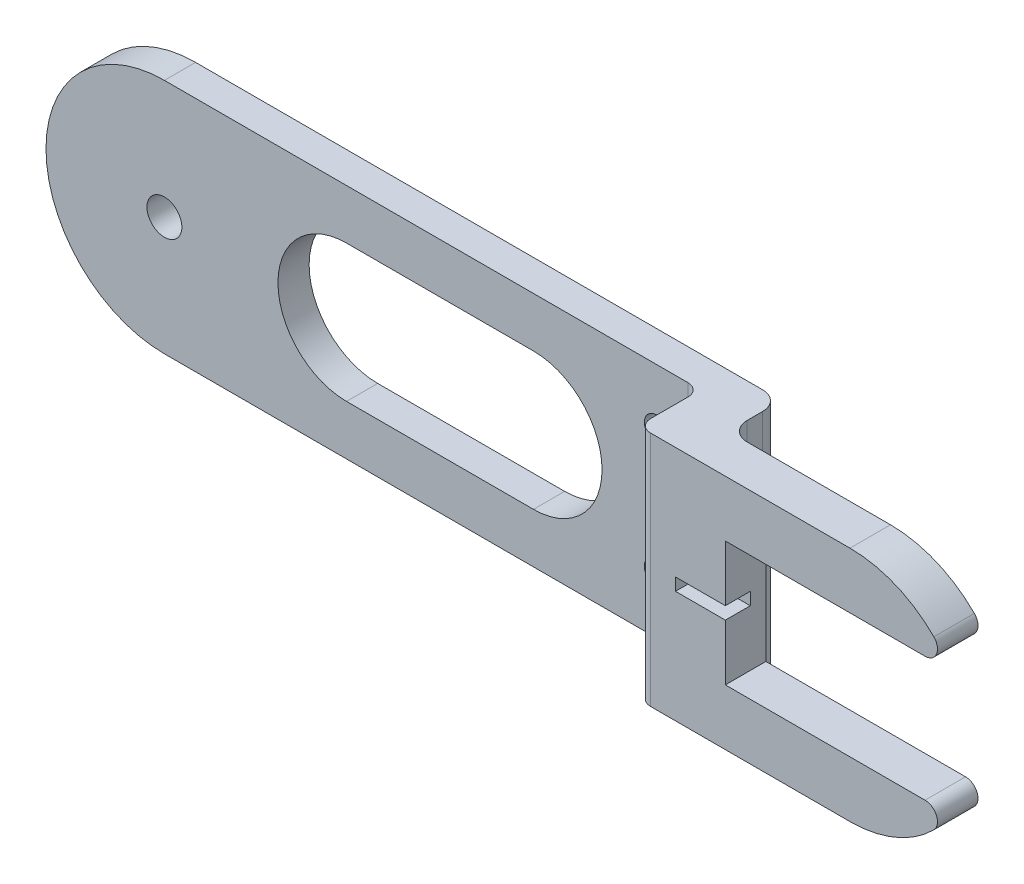
ISO-10303-21;
HEADER;
FILE_DESCRIPTION(('STEP AP214'),'2;1');
FILE_NAME('part.step','',(''),(''),'','','');
FILE_SCHEMA(('AUTOMOTIVE_DESIGN { 1 0 10303 214 1 1 1 1 }'));
ENDSEC;
DATA;
#1=APPLICATION_CONTEXT('core data for automotive mechanical design processes');
#2=APPLICATION_PROTOCOL_DEFINITION('international standard','automotive_design',2000,#1);
#3=PRODUCT_CONTEXT('',#1,'mechanical');
#4=PRODUCT('Part','Part','',(#3));
#5=PRODUCT_RELATED_PRODUCT_CATEGORY('part','',(#4));
#6=PRODUCT_DEFINITION_FORMATION('','',#4);
#7=PRODUCT_DEFINITION_CONTEXT('part definition',#1,'design');
#8=PRODUCT_DEFINITION('design','',#6,#7);
#9=PRODUCT_DEFINITION_SHAPE('','',#8);
#10=(LENGTH_UNIT() NAMED_UNIT(*) SI_UNIT(.MILLI.,.METRE.));
#11=(NAMED_UNIT(*) PLANE_ANGLE_UNIT() SI_UNIT($,.RADIAN.));
#12=(NAMED_UNIT(*) SI_UNIT($,.STERADIAN.) SOLID_ANGLE_UNIT());
#13=UNCERTAINTY_MEASURE_WITH_UNIT(LENGTH_MEASURE(1.E-05),#10,'distance_accuracy_value','');
#14=(GEOMETRIC_REPRESENTATION_CONTEXT(3) GLOBAL_UNCERTAINTY_ASSIGNED_CONTEXT((#13)) GLOBAL_UNIT_ASSIGNED_CONTEXT((#10,
#11,#12)) REPRESENTATION_CONTEXT('',''));
#15=CARTESIAN_POINT('',(0.,0.,0.));
#16=DIRECTION('',(0.,0.,1.));
#17=DIRECTION('',(1.,0.,0.));
#18=AXIS2_PLACEMENT_3D('',#15,#16,#17);
#19=CARTESIAN_POINT('',(0.,0.,5.));
#20=DIRECTION('',(0.,0.,1.));
#21=DIRECTION('',(1.,0.,0.));
#22=AXIS2_PLACEMENT_3D('',#19,#20,#21);
#23=PLANE('',#22);
#24=CARTESIAN_POINT('',(79.,-10.,5.));
#25=DIRECTION('',(0.,0.,1.));
#26=DIRECTION('',(1.,0.,0.));
#27=AXIS2_PLACEMENT_3D('',#24,#25,#26);
#28=CIRCLE('',#27,2.);
#29=CARTESIAN_POINT('',(81.,-10.,5.));
#30=VERTEX_POINT('',#29);
#31=EDGE_CURVE('E305',#30,#30,#28,.T.);
#32=ORIENTED_EDGE('',*,*,#31,.F.);
#33=EDGE_LOOP('',(#32));
#34=FACE_BOUND('',#33,.T.);
#35=CARTESIAN_POINT('',(79.,10.,5.));
#36=DIRECTION('',(0.,0.,1.));
#37=DIRECTION('',(1.,0.,0.));
#38=AXIS2_PLACEMENT_3D('',#35,#36,#37);
#39=CIRCLE('',#38,2.);
#40=CARTESIAN_POINT('',(81.,10.,5.));
#41=VERTEX_POINT('',#40);
#42=EDGE_CURVE('E427',#41,#41,#39,.T.);
#43=ORIENTED_EDGE('',*,*,#42,.F.);
#44=EDGE_LOOP('',(#43));
#45=FACE_BOUND('',#44,.T.);
#46=DIRECTION('',(1.,0.,0.));
#47=VECTOR('',#46,1.);
#48=CARTESIAN_POINT('',(0.,-19.,5.));
#49=LINE('',#48,#47);
#50=CARTESIAN_POINT('',(0.,-19.,5.));
#51=VERTEX_POINT('',#50);
#52=CARTESIAN_POINT('',(84.,-19.,5.));
#53=VERTEX_POINT('',#52);
#54=EDGE_CURVE('E328',#51,#53,#49,.T.);
#55=ORIENTED_EDGE('',*,*,#54,.T.);
#56=DIRECTION('',(0.,-1.,0.));
#57=VECTOR('',#56,1.);
#58=CARTESIAN_POINT('',(84.,0.,5.));
#59=LINE('',#58,#57);
#60=CARTESIAN_POINT('',(84.,19.,5.));
#61=VERTEX_POINT('',#60);
#62=EDGE_CURVE('E265',#53,#61,#59,.F.);
#63=ORIENTED_EDGE('',*,*,#62,.T.);
#64=DIRECTION('',(-1.,0.,0.));
#65=VECTOR('',#64,1.);
#66=CARTESIAN_POINT('',(0.,19.,5.));
#67=LINE('',#66,#65);
#68=CARTESIAN_POINT('',(0.,19.,5.));
#69=VERTEX_POINT('',#68);
#70=EDGE_CURVE('E315',#61,#69,#67,.T.);
#71=ORIENTED_EDGE('',*,*,#70,.T.);
#72=CARTESIAN_POINT('',(0.,0.,5.));
#73=DIRECTION('',(0.,0.,1.));
#74=DIRECTION('',(1.,0.,0.));
#75=AXIS2_PLACEMENT_3D('',#72,#73,#74);
#76=CIRCLE('',#75,19.);
#77=EDGE_CURVE('E320',#69,#51,#76,.T.);
#78=ORIENTED_EDGE('',*,*,#77,.T.);
#79=EDGE_LOOP('',(#55,#63,#71,#78));
#80=FACE_BOUND('',#79,.T.);
#81=CARTESIAN_POINT('',(0.,0.,5.));
#82=DIRECTION('',(0.,0.,1.));
#83=DIRECTION('',(1.,0.,0.));
#84=AXIS2_PLACEMENT_3D('',#81,#82,#83);
#85=CIRCLE('',#84,2.8);
#86=CARTESIAN_POINT('',(2.8,0.,5.));
#87=VERTEX_POINT('',#86);
#88=EDGE_CURVE('E326',#87,#87,#85,.T.);
#89=ORIENTED_EDGE('',*,*,#88,.F.);
#90=EDGE_LOOP('',(#89));
#91=FACE_BOUND('',#90,.T.);
#92=DIRECTION('',(1.,0.,0.));
#93=VECTOR('',#92,1.);
#94=CARTESIAN_POINT('',(29.2177332505722,-11.,5.));
#95=LINE('',#94,#93);
#96=CARTESIAN_POINT('',(29.2177332505722,-11.,5.));
#97=VERTEX_POINT('',#96);
#98=CARTESIAN_POINT('',(59.2177332505723,-11.,5.));
#99=VERTEX_POINT('',#98);
#100=EDGE_CURVE('E367',#97,#99,#95,.T.);
#101=ORIENTED_EDGE('',*,*,#100,.F.);
#102=CARTESIAN_POINT('',(29.2177332505722,0.,5.));
#103=DIRECTION('',(0.,0.,1.));
#104=DIRECTION('',(1.,0.,0.));
#105=AXIS2_PLACEMENT_3D('',#102,#103,#104);
#106=CIRCLE('',#105,11.);
#107=CARTESIAN_POINT('',(29.2177332505722,11.,5.));
#108=VERTEX_POINT('',#107);
#109=EDGE_CURVE('E352',#108,#97,#106,.T.);
#110=ORIENTED_EDGE('',*,*,#109,.F.);
#111=DIRECTION('',(-1.,0.,0.));
#112=VECTOR('',#111,1.);
#113=CARTESIAN_POINT('',(29.2177332505722,11.,5.));
#114=LINE('',#113,#112);
#115=CARTESIAN_POINT('',(59.2177332505723,11.,5.));
#116=VERTEX_POINT('',#115);
#117=EDGE_CURVE('E348',#116,#108,#114,.T.);
#118=ORIENTED_EDGE('',*,*,#117,.F.);
#119=CARTESIAN_POINT('',(59.2177332505723,0.,5.));
#120=DIRECTION('',(0.,0.,1.));
#121=DIRECTION('',(1.,0.,0.));
#122=AXIS2_PLACEMENT_3D('',#119,#120,#121);
#123=CIRCLE('',#122,11.);
#124=EDGE_CURVE('E364',#99,#116,#123,.T.);
#125=ORIENTED_EDGE('',*,*,#124,.F.);
#126=EDGE_LOOP('',(#101,#110,#118,#125));
#127=FACE_BOUND('',#126,.T.);
#128=ADVANCED_FACE('F34',(#34,#45,#80,#91,#127),#23,.T.);
#129=CARTESIAN_POINT('',(0.,0.,0.));
#130=DIRECTION('',(0.,0.,1.));
#131=DIRECTION('',(1.,0.,0.));
#132=AXIS2_PLACEMENT_3D('',#129,#130,#131);
#133=PLANE('',#132);
#134=CARTESIAN_POINT('',(79.,-10.,0.));
#135=DIRECTION('',(0.,0.,1.));
#136=DIRECTION('',(1.,0.,0.));
#137=AXIS2_PLACEMENT_3D('',#134,#135,#136);
#138=CIRCLE('',#137,2.);
#139=CARTESIAN_POINT('',(81.,-10.,0.));
#140=VERTEX_POINT('',#139);
#141=EDGE_CURVE('E430',#140,#140,#138,.T.);
#142=ORIENTED_EDGE('',*,*,#141,.T.);
#143=EDGE_LOOP('',(#142));
#144=FACE_BOUND('',#143,.T.);
#145=CARTESIAN_POINT('',(79.,10.,0.));
#146=DIRECTION('',(0.,0.,1.));
#147=DIRECTION('',(1.,0.,0.));
#148=AXIS2_PLACEMENT_3D('',#145,#146,#147);
#149=CIRCLE('',#148,2.);
#150=CARTESIAN_POINT('',(81.,10.,0.));
#151=VERTEX_POINT('',#150);
#152=EDGE_CURVE('E416',#151,#151,#149,.T.);
#153=ORIENTED_EDGE('',*,*,#152,.T.);
#154=EDGE_LOOP('',(#153));
#155=FACE_BOUND('',#154,.T.);
#156=CARTESIAN_POINT('',(0.,0.,0.));
#157=DIRECTION('',(0.,0.,1.));
#158=DIRECTION('',(1.,0.,0.));
#159=AXIS2_PLACEMENT_3D('',#156,#157,#158);
#160=CIRCLE('',#159,2.8);
#161=CARTESIAN_POINT('',(2.8,0.,0.));
#162=VERTEX_POINT('',#161);
#163=EDGE_CURVE('E333',#162,#162,#160,.T.);
#164=ORIENTED_EDGE('',*,*,#163,.T.);
#165=EDGE_LOOP('',(#164));
#166=FACE_BOUND('',#165,.T.);
#167=DIRECTION('',(-1.,0.,0.));
#168=VECTOR('',#167,1.);
#169=CARTESIAN_POINT('',(0.,19.,0.));
#170=LINE('',#169,#168);
#171=CARTESIAN_POINT('',(91.0000000000001,19.,0.));
#172=VERTEX_POINT('',#171);
#173=CARTESIAN_POINT('',(0.,19.,0.));
#174=VERTEX_POINT('',#173);
#175=EDGE_CURVE('E318',#172,#174,#170,.T.);
#176=ORIENTED_EDGE('',*,*,#175,.F.);
#177=DIRECTION('',(0.,1.,0.));
#178=VECTOR('',#177,1.);
#179=CARTESIAN_POINT('',(91.0000000000001,0.,0.));
#180=LINE('',#179,#178);
#181=CARTESIAN_POINT('',(91.0000000000001,-19.,0.));
#182=VERTEX_POINT('',#181);
#183=EDGE_CURVE('E49',#172,#182,#180,.F.);
#184=ORIENTED_EDGE('',*,*,#183,.T.);
#185=DIRECTION('',(1.,0.,0.));
#186=VECTOR('',#185,1.);
#187=CARTESIAN_POINT('',(0.,-19.,0.));
#188=LINE('',#187,#186);
#189=CARTESIAN_POINT('',(0.,-19.,0.));
#190=VERTEX_POINT('',#189);
#191=EDGE_CURVE('E321',#190,#182,#188,.T.);
#192=ORIENTED_EDGE('',*,*,#191,.F.);
#193=CARTESIAN_POINT('',(0.,0.,0.));
#194=DIRECTION('',(0.,0.,1.));
#195=DIRECTION('',(1.,0.,0.));
#196=AXIS2_PLACEMENT_3D('',#193,#194,#195);
#197=CIRCLE('',#196,19.);
#198=EDGE_CURVE('E323',#174,#190,#197,.T.);
#199=ORIENTED_EDGE('',*,*,#198,.F.);
#200=EDGE_LOOP('',(#176,#184,#192,#199));
#201=FACE_BOUND('',#200,.T.);
#202=CARTESIAN_POINT('',(29.2177332505722,0.,0.));
#203=DIRECTION('',(0.,0.,1.));
#204=DIRECTION('',(1.,0.,0.));
#205=AXIS2_PLACEMENT_3D('',#202,#203,#204);
#206=CIRCLE('',#205,11.);
#207=CARTESIAN_POINT('',(29.2177332505722,11.,0.));
#208=VERTEX_POINT('',#207);
#209=CARTESIAN_POINT('',(29.2177332505722,-11.,0.));
#210=VERTEX_POINT('',#209);
#211=EDGE_CURVE('E359',#208,#210,#206,.T.);
#212=ORIENTED_EDGE('',*,*,#211,.T.);
#213=DIRECTION('',(1.,0.,0.));
#214=VECTOR('',#213,1.);
#215=CARTESIAN_POINT('',(29.2177332505722,-11.,0.));
#216=LINE('',#215,#214);
#217=CARTESIAN_POINT('',(59.2177332505723,-11.,0.));
#218=VERTEX_POINT('',#217);
#219=EDGE_CURVE('E356',#210,#218,#216,.T.);
#220=ORIENTED_EDGE('',*,*,#219,.T.);
#221=CARTESIAN_POINT('',(59.2177332505723,0.,0.));
#222=DIRECTION('',(0.,0.,1.));
#223=DIRECTION('',(1.,0.,0.));
#224=AXIS2_PLACEMENT_3D('',#221,#222,#223);
#225=CIRCLE('',#224,11.);
#226=CARTESIAN_POINT('',(59.2177332505723,11.,0.));
#227=VERTEX_POINT('',#226);
#228=EDGE_CURVE('E353',#218,#227,#225,.T.);
#229=ORIENTED_EDGE('',*,*,#228,.T.);
#230=DIRECTION('',(-1.,0.,0.));
#231=VECTOR('',#230,1.);
#232=CARTESIAN_POINT('',(29.2177332505722,11.,0.));
#233=LINE('',#232,#231);
#234=EDGE_CURVE('E349',#227,#208,#233,.T.);
#235=ORIENTED_EDGE('',*,*,#234,.T.);
#236=EDGE_LOOP('',(#212,#220,#229,#235));
#237=FACE_BOUND('',#236,.T.);
#238=ADVANCED_FACE('F449',(#144,#155,#166,#201,#237),#133,.F.);
#239=CARTESIAN_POINT('',(0.,0.,5.));
#240=DIRECTION('',(0.,0.,-1.));
#241=DIRECTION('',(-1.,0.,0.));
#242=AXIS2_PLACEMENT_3D('',#239,#240,#241);
#243=CYLINDRICAL_SURFACE('',#242,19.);
#244=ORIENTED_EDGE('',*,*,#198,.T.);
#245=DIRECTION('',(0.,0.,-1.));
#246=VECTOR('',#245,1.);
#247=CARTESIAN_POINT('',(0.,-19.,5.));
#248=LINE('',#247,#246);
#249=EDGE_CURVE('E233',#51,#190,#248,.T.);
#250=ORIENTED_EDGE('',*,*,#249,.F.);
#251=ORIENTED_EDGE('',*,*,#77,.F.);
#252=DIRECTION('',(0.,0.,-1.));
#253=VECTOR('',#252,1.);
#254=CARTESIAN_POINT('',(0.,19.,5.));
#255=LINE('',#254,#253);
#256=EDGE_CURVE('E311',#69,#174,#255,.T.);
#257=ORIENTED_EDGE('',*,*,#256,.T.);
#258=EDGE_LOOP('',(#244,#250,#251,#257));
#259=FACE_BOUND('',#258,.T.);
#260=ADVANCED_FACE('F452',(#259),#243,.T.);
#261=CARTESIAN_POINT('',(0.,-19.,5.));
#262=DIRECTION('',(0.,1.,0.));
#263=DIRECTION('',(0.,0.,1.));
#264=AXIS2_PLACEMENT_3D('',#261,#262,#263);
#265=PLANE('',#264);
#266=ORIENTED_EDGE('',*,*,#191,.T.);
#267=CARTESIAN_POINT('',(91.0000000000001,-19.,3.));
#268=DIRECTION('',(0.,1.,0.));
#269=DIRECTION('',(0.,0.,1.));
#270=AXIS2_PLACEMENT_3D('',#267,#268,#269);
#271=CIRCLE('',#270,3.);
#272=CARTESIAN_POINT('',(94.0000000000001,-19.,3.));
#273=VERTEX_POINT('',#272);
#274=EDGE_CURVE('E281',#182,#273,#271,.F.);
#275=ORIENTED_EDGE('',*,*,#274,.T.);
#276=DIRECTION('',(0.,0.,-1.));
#277=VECTOR('',#276,1.);
#278=CARTESIAN_POINT('',(94.0000000000001,-19.,8.5));
#279=LINE('',#278,#277);
#280=CARTESIAN_POINT('',(94.0000000000001,-19.,5.5));
#281=VERTEX_POINT('',#280);
#282=EDGE_CURVE('E293',#281,#273,#279,.T.);
#283=ORIENTED_EDGE('',*,*,#282,.F.);
#284=CARTESIAN_POINT('',(97.0000000000001,-19.,5.5));
#285=DIRECTION('',(0.,1.,0.));
#286=DIRECTION('',(0.,0.,1.));
#287=AXIS2_PLACEMENT_3D('',#284,#285,#286);
#288=CIRCLE('',#287,3.);
#289=CARTESIAN_POINT('',(97.0000000000001,-19.,8.5));
#290=VERTEX_POINT('',#289);
#291=EDGE_CURVE('E11',#281,#290,#288,.T.);
#292=ORIENTED_EDGE('',*,*,#291,.T.);
#293=DIRECTION('',(-1.,0.,0.));
#294=VECTOR('',#293,1.);
#295=CARTESIAN_POINT('',(94.0000000000001,-19.,8.5));
#296=LINE('',#295,#294);
#297=CARTESIAN_POINT('',(120.,-19.,8.5));
#298=VERTEX_POINT('',#297);
#299=EDGE_CURVE('E210',#298,#290,#296,.T.);
#300=ORIENTED_EDGE('',*,*,#299,.F.);
#301=DIRECTION('',(0.,0.,-1.));
#302=VECTOR('',#301,1.);
#303=CARTESIAN_POINT('',(120.,-19.,5.));
#304=LINE('',#303,#302);
#305=CARTESIAN_POINT('',(120.,-19.,15.));
#306=VERTEX_POINT('',#305);
#307=EDGE_CURVE('E224',#306,#298,#304,.T.);
#308=ORIENTED_EDGE('',*,*,#307,.F.);
#309=DIRECTION('',(1.,0.,0.));
#310=VECTOR('',#309,1.);
#311=CARTESIAN_POINT('',(86.,-19.,15.));
#312=LINE('',#311,#310);
#313=CARTESIAN_POINT('',(88.0000000000001,-19.,15.));
#314=VERTEX_POINT('',#313);
#315=EDGE_CURVE('E394',#314,#306,#312,.T.);
#316=ORIENTED_EDGE('',*,*,#315,.F.);
#317=CARTESIAN_POINT('',(88.0000000000001,-19.,13.));
#318=DIRECTION('',(0.,1.,0.));
#319=DIRECTION('',(0.,0.,1.));
#320=AXIS2_PLACEMENT_3D('',#317,#318,#319);
#321=CIRCLE('',#320,2.);
#322=CARTESIAN_POINT('',(86.,-19.,13.));
#323=VERTEX_POINT('',#322);
#324=EDGE_CURVE('E256',#314,#323,#321,.F.);
#325=ORIENTED_EDGE('',*,*,#324,.T.);
#326=DIRECTION('',(0.,0.,-1.));
#327=VECTOR('',#326,1.);
#328=CARTESIAN_POINT('',(86.,-19.,15.));
#329=LINE('',#328,#327);
#330=CARTESIAN_POINT('',(86.,-19.,7.));
#331=VERTEX_POINT('',#330);
#332=EDGE_CURVE('E372',#323,#331,#329,.T.);
#333=ORIENTED_EDGE('',*,*,#332,.T.);
#334=CARTESIAN_POINT('',(84.,-19.,7.));
#335=DIRECTION('',(0.,1.,0.));
#336=DIRECTION('',(0.,0.,1.));
#337=AXIS2_PLACEMENT_3D('',#334,#335,#336);
#338=CIRCLE('',#337,2.);
#339=EDGE_CURVE('E267',#331,#53,#338,.T.);
#340=ORIENTED_EDGE('',*,*,#339,.T.);
#341=ORIENTED_EDGE('',*,*,#54,.F.);
#342=ORIENTED_EDGE('',*,*,#249,.T.);
#343=EDGE_LOOP('',(#266,#275,#283,#292,#300,#308,#316,#325,#333,#340,#341,#342));
#344=FACE_BOUND('',#343,.T.);
#345=ADVANCED_FACE('F222',(#344),#265,.F.);
#346=CARTESIAN_POINT('',(120.,0.,5.));
#347=DIRECTION('',(0.,0.,-1.));
#348=DIRECTION('',(-1.,0.,0.));
#349=AXIS2_PLACEMENT_3D('',#346,#347,#348);
#350=CYLINDRICAL_SURFACE('',#349,19.);
#351=ORIENTED_EDGE('',*,*,#307,.T.);
#352=CARTESIAN_POINT('',(120.,0.,8.5));
#353=DIRECTION('',(0.,0.,1.));
#354=DIRECTION('',(1.,0.,0.));
#355=AXIS2_PLACEMENT_3D('',#352,#353,#354);
#356=CIRCLE('',#355,19.);
#357=CARTESIAN_POINT('',(133.458252764533,-13.4117647058824,8.5));
#358=VERTEX_POINT('',#357);
#359=EDGE_CURVE('E206',#298,#358,#356,.T.);
#360=ORIENTED_EDGE('',*,*,#359,.T.);
#361=DIRECTION('',(0.,0.,-1.));
#362=VECTOR('',#361,1.);
#363=CARTESIAN_POINT('',(133.458252764533,-13.4117647058824,5.));
#364=LINE('',#363,#362);
#365=CARTESIAN_POINT('',(133.458252764533,-13.4117647058824,15.));
#366=VERTEX_POINT('',#365);
#367=EDGE_CURVE('E251',#358,#366,#364,.F.);
#368=ORIENTED_EDGE('',*,*,#367,.T.);
#369=CARTESIAN_POINT('',(120.,0.,15.));
#370=DIRECTION('',(0.,0.,1.));
#371=DIRECTION('',(1.,0.,0.));
#372=AXIS2_PLACEMENT_3D('',#369,#370,#371);
#373=CIRCLE('',#372,19.);
#374=EDGE_CURVE('E232',#306,#366,#373,.T.);
#375=ORIENTED_EDGE('',*,*,#374,.F.);
#376=EDGE_LOOP('',(#351,#360,#368,#375));
#377=FACE_BOUND('',#376,.T.);
#378=ADVANCED_FACE('F230',(#377),#350,.T.);
#379=CARTESIAN_POINT('',(100.,-10.,5.));
#380=DIRECTION('',(0.,-1.,0.));
#381=DIRECTION('',(0.,0.,-1.));
#382=AXIS2_PLACEMENT_3D('',#379,#380,#381);
#383=PLANE('',#382);
#384=DIRECTION('',(0.,0.,-1.));
#385=VECTOR('',#384,1.);
#386=CARTESIAN_POINT('',(132.041594578792,-10.,5.));
#387=LINE('',#386,#385);
#388=CARTESIAN_POINT('',(132.041594578792,-10.,15.));
#389=VERTEX_POINT('',#388);
#390=CARTESIAN_POINT('',(132.041594578792,-10.,8.5));
#391=VERTEX_POINT('',#390);
#392=EDGE_CURVE('E248',#389,#391,#387,.T.);
#393=ORIENTED_EDGE('',*,*,#392,.T.);
#394=DIRECTION('',(-1.,0.,0.));
#395=VECTOR('',#394,1.);
#396=CARTESIAN_POINT('',(100.,-10.,8.5));
#397=LINE('',#396,#395);
#398=CARTESIAN_POINT('',(100.,-10.,8.5));
#399=VERTEX_POINT('',#398);
#400=EDGE_CURVE('E218',#391,#399,#397,.T.);
#401=ORIENTED_EDGE('',*,*,#400,.T.);
#402=DIRECTION('',(0.,0.,-1.));
#403=VECTOR('',#402,1.);
#404=CARTESIAN_POINT('',(100.,-10.,5.));
#405=LINE('',#404,#403);
#406=CARTESIAN_POINT('',(100.,-10.,15.));
#407=VERTEX_POINT('',#406);
#408=EDGE_CURVE('E234',#407,#399,#405,.T.);
#409=ORIENTED_EDGE('',*,*,#408,.F.);
#410=DIRECTION('',(-1.,0.,0.));
#411=VECTOR('',#410,1.);
#412=CARTESIAN_POINT('',(132.041594578792,-10.,15.));
#413=LINE('',#412,#411);
#414=EDGE_CURVE('E387',#389,#407,#413,.T.);
#415=ORIENTED_EDGE('',*,*,#414,.F.);
#416=EDGE_LOOP('',(#393,#401,#409,#415));
#417=FACE_BOUND('',#416,.T.);
#418=ADVANCED_FACE('F488',(#417),#383,.F.);
#419=CARTESIAN_POINT('',(100.,-10.,5.));
#420=DIRECTION('',(-1.,0.,0.));
#421=DIRECTION('',(0.,0.,1.));
#422=AXIS2_PLACEMENT_3D('',#419,#420,#421);
#423=PLANE('',#422);
#424=ORIENTED_EDGE('',*,*,#408,.T.);
#425=DIRECTION('',(0.,1.,0.));
#426=VECTOR('',#425,1.);
#427=CARTESIAN_POINT('',(100.,-10.,8.5));
#428=LINE('',#427,#426);
#429=CARTESIAN_POINT('',(100.,9.99999999999998,8.5));
#430=VERTEX_POINT('',#429);
#431=EDGE_CURVE('E217',#399,#430,#428,.T.);
#432=ORIENTED_EDGE('',*,*,#431,.T.);
#433=DIRECTION('',(0.,0.,-1.));
#434=VECTOR('',#433,1.);
#435=CARTESIAN_POINT('',(100.,9.99999999999998,5.));
#436=LINE('',#435,#434);
#437=CARTESIAN_POINT('',(100.,9.99999999999998,15.));
#438=VERTEX_POINT('',#437);
#439=EDGE_CURVE('E240',#438,#430,#436,.T.);
#440=ORIENTED_EDGE('',*,*,#439,.F.);
#441=DIRECTION('',(0.,1.,0.));
#442=VECTOR('',#441,1.);
#443=CARTESIAN_POINT('',(100.,-10.,15.));
#444=LINE('',#443,#442);
#445=CARTESIAN_POINT('',(100.,0.999999999999996,15.));
#446=VERTEX_POINT('',#445);
#447=EDGE_CURVE('E386',#446,#438,#444,.T.);
#448=ORIENTED_EDGE('',*,*,#447,.F.);
#449=DIRECTION('',(0.,0.,1.));
#450=VECTOR('',#449,1.);
#451=CARTESIAN_POINT('',(100.,0.999999999999996,11.));
#452=LINE('',#451,#450);
#453=CARTESIAN_POINT('',(100.,0.999999999999996,11.));
#454=VERTEX_POINT('',#453);
#455=EDGE_CURVE('E398',#454,#446,#452,.T.);
#456=ORIENTED_EDGE('',*,*,#455,.F.);
#457=DIRECTION('',(0.,1.,0.));
#458=VECTOR('',#457,1.);
#459=CARTESIAN_POINT('',(100.,0.999999999999996,11.));
#460=LINE('',#459,#458);
#461=CARTESIAN_POINT('',(100.,-1.,11.));
#462=VERTEX_POINT('',#461);
#463=EDGE_CURVE('E409',#462,#454,#460,.T.);
#464=ORIENTED_EDGE('',*,*,#463,.F.);
#465=DIRECTION('',(0.,0.,1.));
#466=VECTOR('',#465,1.);
#467=CARTESIAN_POINT('',(100.,-1.,11.));
#468=LINE('',#467,#466);
#469=CARTESIAN_POINT('',(100.,-1.,15.));
#470=VERTEX_POINT('',#469);
#471=EDGE_CURVE('E397',#462,#470,#468,.T.);
#472=ORIENTED_EDGE('',*,*,#471,.T.);
#473=EDGE_CURVE('E383',#407,#470,#444,.T.);
#474=ORIENTED_EDGE('',*,*,#473,.F.);
#475=EDGE_LOOP('',(#424,#432,#440,#448,#456,#464,#472,#474));
#476=FACE_BOUND('',#475,.T.);
#477=ADVANCED_FACE('F484',(#476),#423,.F.);
#478=CARTESIAN_POINT('',(100.,9.99999999999998,5.));
#479=DIRECTION('',(0.,1.,0.));
#480=DIRECTION('',(-1.,0.,0.));
#481=AXIS2_PLACEMENT_3D('',#478,#479,#480);
#482=PLANE('',#481);
#483=ORIENTED_EDGE('',*,*,#439,.T.);
#484=DIRECTION('',(1.,0.,0.));
#485=VECTOR('',#484,1.);
#486=CARTESIAN_POINT('',(100.,9.99999999999998,8.5));
#487=LINE('',#486,#485);
#488=CARTESIAN_POINT('',(132.041594578792,9.99999999999999,8.5));
#489=VERTEX_POINT('',#488);
#490=EDGE_CURVE('E438',#430,#489,#487,.T.);
#491=ORIENTED_EDGE('',*,*,#490,.T.);
#492=DIRECTION('',(0.,0.,-1.));
#493=VECTOR('',#492,1.);
#494=CARTESIAN_POINT('',(132.041594578792,9.99999999999999,5.));
#495=LINE('',#494,#493);
#496=CARTESIAN_POINT('',(132.041594578792,9.99999999999999,15.));
#497=VERTEX_POINT('',#496);
#498=EDGE_CURVE('E246',#489,#497,#495,.F.);
#499=ORIENTED_EDGE('',*,*,#498,.T.);
#500=DIRECTION('',(1.,0.,0.));
#501=VECTOR('',#500,1.);
#502=CARTESIAN_POINT('',(100.,9.99999999999998,15.));
#503=LINE('',#502,#501);
#504=EDGE_CURVE('E380',#438,#497,#503,.T.);
#505=ORIENTED_EDGE('',*,*,#504,.F.);
#506=EDGE_LOOP('',(#483,#491,#499,#505));
#507=FACE_BOUND('',#506,.T.);
#508=ADVANCED_FACE('F480',(#507),#482,.F.);
#509=CARTESIAN_POINT('',(120.,0.,5.));
#510=DIRECTION('',(0.,0.,-1.));
#511=DIRECTION('',(-1.,0.,0.));
#512=AXIS2_PLACEMENT_3D('',#509,#510,#511);
#513=CYLINDRICAL_SURFACE('',#512,19.);
#514=DIRECTION('',(0.,0.,-1.));
#515=VECTOR('',#514,1.);
#516=CARTESIAN_POINT('',(133.458252764533,13.4117647058823,5.));
#517=LINE('',#516,#515);
#518=CARTESIAN_POINT('',(133.458252764533,13.4117647058823,15.));
#519=VERTEX_POINT('',#518);
#520=CARTESIAN_POINT('',(133.458252764533,13.4117647058823,8.5));
#521=VERTEX_POINT('',#520);
#522=EDGE_CURVE('E237',#519,#521,#517,.T.);
#523=ORIENTED_EDGE('',*,*,#522,.T.);
#524=CARTESIAN_POINT('',(120.,0.,8.5));
#525=DIRECTION('',(0.,0.,1.));
#526=DIRECTION('',(1.,0.,0.));
#527=AXIS2_PLACEMENT_3D('',#524,#525,#526);
#528=CIRCLE('',#527,19.);
#529=CARTESIAN_POINT('',(120.,19.,8.5));
#530=VERTEX_POINT('',#529);
#531=EDGE_CURVE('E297',#521,#530,#528,.T.);
#532=ORIENTED_EDGE('',*,*,#531,.T.);
#533=DIRECTION('',(0.,0.,-1.));
#534=VECTOR('',#533,1.);
#535=CARTESIAN_POINT('',(120.,19.,5.));
#536=LINE('',#535,#534);
#537=CARTESIAN_POINT('',(120.,19.,15.));
#538=VERTEX_POINT('',#537);
#539=EDGE_CURVE('E303',#538,#530,#536,.T.);
#540=ORIENTED_EDGE('',*,*,#539,.F.);
#541=CARTESIAN_POINT('',(120.,0.,15.));
#542=DIRECTION('',(0.,0.,1.));
#543=DIRECTION('',(1.,0.,0.));
#544=AXIS2_PLACEMENT_3D('',#541,#542,#543);
#545=CIRCLE('',#544,19.);
#546=EDGE_CURVE('E375',#519,#538,#545,.T.);
#547=ORIENTED_EDGE('',*,*,#546,.F.);
#548=EDGE_LOOP('',(#523,#532,#540,#547));
#549=FACE_BOUND('',#548,.T.);
#550=ADVANCED_FACE('F301',(#549),#513,.T.);
#551=CARTESIAN_POINT('',(0.,19.,5.));
#552=DIRECTION('',(0.,-1.,0.));
#553=DIRECTION('',(0.,0.,-1.));
#554=AXIS2_PLACEMENT_3D('',#551,#552,#553);
#555=PLANE('',#554);
#556=DIRECTION('',(0.,0.,-1.));
#557=VECTOR('',#556,1.);
#558=CARTESIAN_POINT('',(94.0000000000001,19.,8.5));
#559=LINE('',#558,#557);
#560=CARTESIAN_POINT('',(94.0000000000001,19.,5.5));
#561=VERTEX_POINT('',#560);
#562=CARTESIAN_POINT('',(94.0000000000001,19.,3.));
#563=VERTEX_POINT('',#562);
#564=EDGE_CURVE('E285',#561,#563,#559,.T.);
#565=ORIENTED_EDGE('',*,*,#564,.T.);
#566=CARTESIAN_POINT('',(91.0000000000001,19.,3.));
#567=DIRECTION('',(0.,-1.,0.));
#568=DIRECTION('',(0.,0.,-1.));
#569=AXIS2_PLACEMENT_3D('',#566,#567,#568);
#570=CIRCLE('',#569,3.);
#571=EDGE_CURVE('E57',#563,#172,#570,.F.);
#572=ORIENTED_EDGE('',*,*,#571,.T.);
#573=ORIENTED_EDGE('',*,*,#175,.T.);
#574=ORIENTED_EDGE('',*,*,#256,.F.);
#575=ORIENTED_EDGE('',*,*,#70,.F.);
#576=CARTESIAN_POINT('',(84.,19.,7.));
#577=DIRECTION('',(0.,-1.,0.));
#578=DIRECTION('',(0.,0.,-1.));
#579=AXIS2_PLACEMENT_3D('',#576,#577,#578);
#580=CIRCLE('',#579,2.);
#581=CARTESIAN_POINT('',(86.,19.,7.));
#582=VERTEX_POINT('',#581);
#583=EDGE_CURVE('E269',#61,#582,#580,.T.);
#584=ORIENTED_EDGE('',*,*,#583,.T.);
#585=DIRECTION('',(0.,0.,-1.));
#586=VECTOR('',#585,1.);
#587=CARTESIAN_POINT('',(86.,19.,15.));
#588=LINE('',#587,#586);
#589=CARTESIAN_POINT('',(86.,19.,13.));
#590=VERTEX_POINT('',#589);
#591=EDGE_CURVE('E362',#590,#582,#588,.T.);
#592=ORIENTED_EDGE('',*,*,#591,.F.);
#593=CARTESIAN_POINT('',(88.0000000000001,19.,13.));
#594=DIRECTION('',(0.,-1.,0.));
#595=DIRECTION('',(0.,0.,-1.));
#596=AXIS2_PLACEMENT_3D('',#593,#594,#595);
#597=CIRCLE('',#596,2.);
#598=CARTESIAN_POINT('',(88.0000000000001,19.,15.));
#599=VERTEX_POINT('',#598);
#600=EDGE_CURVE('E263',#590,#599,#597,.F.);
#601=ORIENTED_EDGE('',*,*,#600,.T.);
#602=DIRECTION('',(-1.,0.,0.));
#603=VECTOR('',#602,1.);
#604=CARTESIAN_POINT('',(120.,19.,15.));
#605=LINE('',#604,#603);
#606=EDGE_CURVE('E310',#538,#599,#605,.T.);
#607=ORIENTED_EDGE('',*,*,#606,.F.);
#608=ORIENTED_EDGE('',*,*,#539,.T.);
#609=DIRECTION('',(1.,0.,0.));
#610=VECTOR('',#609,1.);
#611=CARTESIAN_POINT('',(183.22986745124,19.,8.5));
#612=LINE('',#611,#610);
#613=CARTESIAN_POINT('',(97.0000000000001,19.,8.5));
#614=VERTEX_POINT('',#613);
#615=EDGE_CURVE('E228',#614,#530,#612,.T.);
#616=ORIENTED_EDGE('',*,*,#615,.F.);
#617=CARTESIAN_POINT('',(97.0000000000001,19.,5.5));
#618=DIRECTION('',(0.,-1.,0.));
#619=DIRECTION('',(0.,0.,-1.));
#620=AXIS2_PLACEMENT_3D('',#617,#618,#619);
#621=CIRCLE('',#620,3.);
#622=EDGE_CURVE('E42',#614,#561,#621,.T.);
#623=ORIENTED_EDGE('',*,*,#622,.T.);
#624=EDGE_LOOP('',(#565,#572,#573,#574,#575,#584,#592,#601,#607,#608,#616,#623));
#625=FACE_BOUND('',#624,.T.);
#626=ADVANCED_FACE('F284',(#625),#555,.F.);
#627=CARTESIAN_POINT('',(0.,0.,5.));
#628=DIRECTION('',(0.,0.,-1.));
#629=DIRECTION('',(-1.,0.,0.));
#630=AXIS2_PLACEMENT_3D('',#627,#628,#629);
#631=CYLINDRICAL_SURFACE('',#630,2.8);
#632=ORIENTED_EDGE('',*,*,#88,.T.);
#633=EDGE_LOOP('',(#632));
#634=FACE_BOUND('',#633,.T.);
#635=ORIENTED_EDGE('',*,*,#163,.F.);
#636=EDGE_LOOP('',(#635));
#637=FACE_BOUND('',#636,.T.);
#638=ADVANCED_FACE('F527',(#634,#637),#631,.F.);
#639=CARTESIAN_POINT('',(29.2177332505722,0.,5.));
#640=DIRECTION('',(0.,0.,-1.));
#641=DIRECTION('',(-1.,0.,0.));
#642=AXIS2_PLACEMENT_3D('',#639,#640,#641);
#643=CYLINDRICAL_SURFACE('',#642,11.);
#644=ORIENTED_EDGE('',*,*,#211,.F.);
#645=DIRECTION('',(0.,0.,-1.));
#646=VECTOR('',#645,1.);
#647=CARTESIAN_POINT('',(29.2177332505722,11.,5.));
#648=LINE('',#647,#646);
#649=EDGE_CURVE('E345',#108,#208,#648,.T.);
#650=ORIENTED_EDGE('',*,*,#649,.F.);
#651=ORIENTED_EDGE('',*,*,#109,.T.);
#652=DIRECTION('',(0.,0.,-1.));
#653=VECTOR('',#652,1.);
#654=CARTESIAN_POINT('',(29.2177332505722,-11.,5.));
#655=LINE('',#654,#653);
#656=EDGE_CURVE('E336',#97,#210,#655,.T.);
#657=ORIENTED_EDGE('',*,*,#656,.T.);
#658=EDGE_LOOP('',(#644,#650,#651,#657));
#659=FACE_BOUND('',#658,.T.);
#660=ADVANCED_FACE('F709',(#659),#643,.F.);
#661=CARTESIAN_POINT('',(29.2177332505722,-11.,5.));
#662=DIRECTION('',(0.,1.,0.));
#663=DIRECTION('',(0.,0.,1.));
#664=AXIS2_PLACEMENT_3D('',#661,#662,#663);
#665=PLANE('',#664);
#666=ORIENTED_EDGE('',*,*,#219,.F.);
#667=ORIENTED_EDGE('',*,*,#656,.F.);
#668=ORIENTED_EDGE('',*,*,#100,.T.);
#669=DIRECTION('',(0.,0.,-1.));
#670=VECTOR('',#669,1.);
#671=CARTESIAN_POINT('',(59.2177332505723,-11.,5.));
#672=LINE('',#671,#670);
#673=EDGE_CURVE('E341',#99,#218,#672,.T.);
#674=ORIENTED_EDGE('',*,*,#673,.T.);
#675=EDGE_LOOP('',(#666,#667,#668,#674));
#676=FACE_BOUND('',#675,.T.);
#677=ADVANCED_FACE('F717',(#676),#665,.T.);
#678=CARTESIAN_POINT('',(59.2177332505723,0.,5.));
#679=DIRECTION('',(0.,0.,-1.));
#680=DIRECTION('',(-1.,0.,0.));
#681=AXIS2_PLACEMENT_3D('',#678,#679,#680);
#682=CYLINDRICAL_SURFACE('',#681,11.);
#683=ORIENTED_EDGE('',*,*,#228,.F.);
#684=ORIENTED_EDGE('',*,*,#673,.F.);
#685=ORIENTED_EDGE('',*,*,#124,.T.);
#686=DIRECTION('',(0.,0.,-1.));
#687=VECTOR('',#686,1.);
#688=CARTESIAN_POINT('',(59.2177332505723,11.,5.));
#689=LINE('',#688,#687);
#690=EDGE_CURVE('E343',#116,#227,#689,.T.);
#691=ORIENTED_EDGE('',*,*,#690,.T.);
#692=EDGE_LOOP('',(#683,#684,#685,#691));
#693=FACE_BOUND('',#692,.T.);
#694=ADVANCED_FACE('F724',(#693),#682,.F.);
#695=CARTESIAN_POINT('',(29.2177332505722,11.,5.));
#696=DIRECTION('',(0.,-1.,0.));
#697=DIRECTION('',(0.,0.,-1.));
#698=AXIS2_PLACEMENT_3D('',#695,#696,#697);
#699=PLANE('',#698);
#700=ORIENTED_EDGE('',*,*,#234,.F.);
#701=ORIENTED_EDGE('',*,*,#690,.F.);
#702=ORIENTED_EDGE('',*,*,#117,.T.);
#703=ORIENTED_EDGE('',*,*,#649,.T.);
#704=EDGE_LOOP('',(#700,#701,#702,#703));
#705=FACE_BOUND('',#704,.T.);
#706=ADVANCED_FACE('F548',(#705),#699,.T.);
#707=CARTESIAN_POINT('',(132.041594578792,12.,5.));
#708=DIRECTION('',(0.,0.,-1.));
#709=DIRECTION('',(-1.,0.,0.));
#710=AXIS2_PLACEMENT_3D('',#707,#708,#709);
#711=CYLINDRICAL_SURFACE('',#710,2.);
#712=CARTESIAN_POINT('',(132.041594578792,12.,8.5));
#713=DIRECTION('',(0.,0.,1.));
#714=DIRECTION('',(1.,0.,0.));
#715=AXIS2_PLACEMENT_3D('',#712,#713,#714);
#716=CIRCLE('',#715,2.);
#717=EDGE_CURVE('E306',#521,#489,#716,.F.);
#718=ORIENTED_EDGE('',*,*,#717,.F.);
#719=ORIENTED_EDGE('',*,*,#522,.F.);
#720=CARTESIAN_POINT('',(132.041594578792,12.,15.));
#721=DIRECTION('',(0.,0.,1.));
#722=DIRECTION('',(1.,0.,0.));
#723=AXIS2_PLACEMENT_3D('',#720,#721,#722);
#724=CIRCLE('',#723,2.);
#725=EDGE_CURVE('E377',#497,#519,#724,.T.);
#726=ORIENTED_EDGE('',*,*,#725,.F.);
#727=ORIENTED_EDGE('',*,*,#498,.F.);
#728=EDGE_LOOP('',(#718,#719,#726,#727));
#729=FACE_BOUND('',#728,.T.);
#730=ADVANCED_FACE('F478',(#729),#711,.T.);
#731=CARTESIAN_POINT('',(132.041594578792,-12.,5.));
#732=DIRECTION('',(0.,0.,-1.));
#733=DIRECTION('',(-1.,0.,0.));
#734=AXIS2_PLACEMENT_3D('',#731,#732,#733);
#735=CYLINDRICAL_SURFACE('',#734,2.);
#736=CARTESIAN_POINT('',(132.041594578792,-12.,8.5));
#737=DIRECTION('',(0.,0.,1.));
#738=DIRECTION('',(1.,0.,0.));
#739=AXIS2_PLACEMENT_3D('',#736,#737,#738);
#740=CIRCLE('',#739,2.);
#741=EDGE_CURVE('E213',#391,#358,#740,.F.);
#742=ORIENTED_EDGE('',*,*,#741,.F.);
#743=ORIENTED_EDGE('',*,*,#392,.F.);
#744=CARTESIAN_POINT('',(132.041594578792,-12.,15.));
#745=DIRECTION('',(0.,0.,1.));
#746=DIRECTION('',(1.,0.,0.));
#747=AXIS2_PLACEMENT_3D('',#744,#745,#746);
#748=CIRCLE('',#747,2.);
#749=EDGE_CURVE('E390',#366,#389,#748,.T.);
#750=ORIENTED_EDGE('',*,*,#749,.F.);
#751=ORIENTED_EDGE('',*,*,#367,.F.);
#752=EDGE_LOOP('',(#742,#743,#750,#751));
#753=FACE_BOUND('',#752,.T.);
#754=ADVANCED_FACE('F492',(#753),#735,.T.);
#755=CARTESIAN_POINT('',(86.,19.,15.));
#756=DIRECTION('',(1.,0.,0.));
#757=DIRECTION('',(0.,0.,-1.));
#758=AXIS2_PLACEMENT_3D('',#755,#756,#757);
#759=PLANE('',#758);
#760=ORIENTED_EDGE('',*,*,#332,.F.);
#761=DIRECTION('',(0.,-1.,0.));
#762=VECTOR('',#761,1.);
#763=CARTESIAN_POINT('',(86.,19.,13.));
#764=LINE('',#763,#762);
#765=EDGE_CURVE('E261',#323,#590,#764,.F.);
#766=ORIENTED_EDGE('',*,*,#765,.T.);
#767=ORIENTED_EDGE('',*,*,#591,.T.);
#768=DIRECTION('',(0.,-1.,0.));
#769=VECTOR('',#768,1.);
#770=CARTESIAN_POINT('',(86.,19.,7.));
#771=LINE('',#770,#769);
#772=EDGE_CURVE('E258',#582,#331,#771,.T.);
#773=ORIENTED_EDGE('',*,*,#772,.T.);
#774=EDGE_LOOP('',(#760,#766,#767,#773));
#775=FACE_BOUND('',#774,.T.);
#776=ADVANCED_FACE('F465',(#775),#759,.F.);
#777=CARTESIAN_POINT('',(120.,0.,15.));
#778=DIRECTION('',(0.,0.,1.));
#779=DIRECTION('',(1.,0.,0.));
#780=AXIS2_PLACEMENT_3D('',#777,#778,#779);
#781=PLANE('',#780);
#782=DIRECTION('',(1.,0.,0.));
#783=VECTOR('',#782,1.);
#784=CARTESIAN_POINT('',(100.,-1.,15.));
#785=LINE('',#784,#783);
#786=CARTESIAN_POINT('',(92.0000000000001,-1.,15.));
#787=VERTEX_POINT('',#786);
#788=EDGE_CURVE('E407',#787,#470,#785,.T.);
#789=ORIENTED_EDGE('',*,*,#788,.F.);
#790=DIRECTION('',(0.,-1.,0.));
#791=VECTOR('',#790,1.);
#792=CARTESIAN_POINT('',(92.0000000000001,0.999999999999995,15.));
#793=LINE('',#792,#791);
#794=CARTESIAN_POINT('',(92.0000000000001,0.999999999999995,15.));
#795=VERTEX_POINT('',#794);
#796=EDGE_CURVE('E410',#795,#787,#793,.T.);
#797=ORIENTED_EDGE('',*,*,#796,.F.);
#798=DIRECTION('',(-1.,0.,0.));
#799=VECTOR('',#798,1.);
#800=CARTESIAN_POINT('',(100.,0.999999999999996,15.));
#801=LINE('',#800,#799);
#802=EDGE_CURVE('E413',#446,#795,#801,.T.);
#803=ORIENTED_EDGE('',*,*,#802,.F.);
#804=ORIENTED_EDGE('',*,*,#447,.T.);
#805=ORIENTED_EDGE('',*,*,#504,.T.);
#806=ORIENTED_EDGE('',*,*,#725,.T.);
#807=ORIENTED_EDGE('',*,*,#546,.T.);
#808=ORIENTED_EDGE('',*,*,#606,.T.);
#809=DIRECTION('',(0.,-1.,0.));
#810=VECTOR('',#809,1.);
#811=CARTESIAN_POINT('',(88.0000000000001,-19.,15.));
#812=LINE('',#811,#810);
#813=EDGE_CURVE('E253',#599,#314,#812,.T.);
#814=ORIENTED_EDGE('',*,*,#813,.T.);
#815=ORIENTED_EDGE('',*,*,#315,.T.);
#816=ORIENTED_EDGE('',*,*,#374,.T.);
#817=ORIENTED_EDGE('',*,*,#749,.T.);
#818=ORIENTED_EDGE('',*,*,#414,.T.);
#819=ORIENTED_EDGE('',*,*,#473,.T.);
#820=EDGE_LOOP('',(#789,#797,#803,#804,#805,#806,#807,#808,#814,#815,#816,#817,#818,#819));
#821=FACE_BOUND('',#820,.T.);
#822=ADVANCED_FACE('F473',(#821),#781,.T.);
#823=CARTESIAN_POINT('',(88.0000000000001,0.,13.));
#824=DIRECTION('',(0.,1.,0.));
#825=DIRECTION('',(0.,0.,1.));
#826=AXIS2_PLACEMENT_3D('',#823,#824,#825);
#827=CYLINDRICAL_SURFACE('',#826,2.);
#828=ORIENTED_EDGE('',*,*,#600,.F.);
#829=ORIENTED_EDGE('',*,*,#765,.F.);
#830=ORIENTED_EDGE('',*,*,#324,.F.);
#831=ORIENTED_EDGE('',*,*,#813,.F.);
#832=EDGE_LOOP('',(#828,#829,#830,#831));
#833=FACE_BOUND('',#832,.T.);
#834=ADVANCED_FACE('F470',(#833),#827,.T.);
#835=CARTESIAN_POINT('',(84.,19.,7.));
#836=DIRECTION('',(0.,-1.,0.));
#837=DIRECTION('',(0.,0.,-1.));
#838=AXIS2_PLACEMENT_3D('',#835,#836,#837);
#839=CYLINDRICAL_SURFACE('',#838,2.);
#840=ORIENTED_EDGE('',*,*,#583,.F.);
#841=ORIENTED_EDGE('',*,*,#62,.F.);
#842=ORIENTED_EDGE('',*,*,#339,.F.);
#843=ORIENTED_EDGE('',*,*,#772,.F.);
#844=EDGE_LOOP('',(#840,#841,#842,#843));
#845=FACE_BOUND('',#844,.T.);
#846=ADVANCED_FACE('F462',(#845),#839,.F.);
#847=CARTESIAN_POINT('',(100.,-1.,11.));
#848=DIRECTION('',(0.,-1.,0.));
#849=DIRECTION('',(1.,0.,0.));
#850=AXIS2_PLACEMENT_3D('',#847,#848,#849);
#851=PLANE('',#850);
#852=ORIENTED_EDGE('',*,*,#788,.T.);
#853=ORIENTED_EDGE('',*,*,#471,.F.);
#854=DIRECTION('',(1.,0.,0.));
#855=VECTOR('',#854,1.);
#856=CARTESIAN_POINT('',(100.,-1.,11.));
#857=LINE('',#856,#855);
#858=CARTESIAN_POINT('',(92.0000000000001,-1.,11.));
#859=VERTEX_POINT('',#858);
#860=EDGE_CURVE('E401',#859,#462,#857,.T.);
#861=ORIENTED_EDGE('',*,*,#860,.F.);
#862=DIRECTION('',(0.,0.,1.));
#863=VECTOR('',#862,1.);
#864=CARTESIAN_POINT('',(92.0000000000001,-1.,11.));
#865=LINE('',#864,#863);
#866=EDGE_CURVE('E403',#859,#787,#865,.T.);
#867=ORIENTED_EDGE('',*,*,#866,.T.);
#868=EDGE_LOOP('',(#852,#853,#861,#867));
#869=FACE_BOUND('',#868,.T.);
#870=ADVANCED_FACE('F496',(#869),#851,.F.);
#871=CARTESIAN_POINT('',(92.0000000000001,0.999999999999995,11.));
#872=DIRECTION('',(-1.,0.,0.));
#873=DIRECTION('',(0.,0.,1.));
#874=AXIS2_PLACEMENT_3D('',#871,#872,#873);
#875=PLANE('',#874);
#876=ORIENTED_EDGE('',*,*,#796,.T.);
#877=ORIENTED_EDGE('',*,*,#866,.F.);
#878=DIRECTION('',(0.,-1.,0.));
#879=VECTOR('',#878,1.);
#880=CARTESIAN_POINT('',(92.0000000000001,0.999999999999995,11.));
#881=LINE('',#880,#879);
#882=CARTESIAN_POINT('',(92.0000000000001,0.999999999999995,11.));
#883=VERTEX_POINT('',#882);
#884=EDGE_CURVE('E419',#883,#859,#881,.T.);
#885=ORIENTED_EDGE('',*,*,#884,.F.);
#886=DIRECTION('',(0.,0.,1.));
#887=VECTOR('',#886,1.);
#888=CARTESIAN_POINT('',(92.0000000000001,0.999999999999995,11.));
#889=LINE('',#888,#887);
#890=EDGE_CURVE('E400',#883,#795,#889,.T.);
#891=ORIENTED_EDGE('',*,*,#890,.T.);
#892=EDGE_LOOP('',(#876,#877,#885,#891));
#893=FACE_BOUND('',#892,.T.);
#894=ADVANCED_FACE('F501',(#893),#875,.F.);
#895=CARTESIAN_POINT('',(100.,0.999999999999996,11.));
#896=DIRECTION('',(0.,1.,0.));
#897=DIRECTION('',(-1.,0.,0.));
#898=AXIS2_PLACEMENT_3D('',#895,#896,#897);
#899=PLANE('',#898);
#900=ORIENTED_EDGE('',*,*,#802,.T.);
#901=ORIENTED_EDGE('',*,*,#890,.F.);
#902=DIRECTION('',(-1.,0.,0.));
#903=VECTOR('',#902,1.);
#904=CARTESIAN_POINT('',(100.,0.999999999999996,11.));
#905=LINE('',#904,#903);
#906=EDGE_CURVE('E422',#454,#883,#905,.T.);
#907=ORIENTED_EDGE('',*,*,#906,.F.);
#908=ORIENTED_EDGE('',*,*,#455,.T.);
#909=EDGE_LOOP('',(#900,#901,#907,#908));
#910=FACE_BOUND('',#909,.T.);
#911=ADVANCED_FACE('F505',(#910),#899,.F.);
#912=CARTESIAN_POINT('',(0.,0.,11.));
#913=DIRECTION('',(0.,0.,-1.));
#914=DIRECTION('',(-1.,0.,0.));
#915=AXIS2_PLACEMENT_3D('',#912,#913,#914);
#916=PLANE('',#915);
#917=ORIENTED_EDGE('',*,*,#463,.T.);
#918=ORIENTED_EDGE('',*,*,#906,.T.);
#919=ORIENTED_EDGE('',*,*,#884,.T.);
#920=ORIENTED_EDGE('',*,*,#860,.T.);
#921=EDGE_LOOP('',(#917,#918,#919,#920));
#922=FACE_BOUND('',#921,.T.);
#923=ADVANCED_FACE('F498',(#922),#916,.F.);
#924=CARTESIAN_POINT('',(79.,10.,0.));
#925=DIRECTION('',(0.,0.,1.));
#926=DIRECTION('',(1.,0.,0.));
#927=AXIS2_PLACEMENT_3D('',#924,#925,#926);
#928=CYLINDRICAL_SURFACE('',#927,2.);
#929=ORIENTED_EDGE('',*,*,#152,.F.);
#930=EDGE_LOOP('',(#929));
#931=FACE_BOUND('',#930,.T.);
#932=ORIENTED_EDGE('',*,*,#42,.T.);
#933=EDGE_LOOP('',(#932));
#934=FACE_BOUND('',#933,.T.);
#935=ADVANCED_FACE('F512',(#931,#934),#928,.F.);
#936=CARTESIAN_POINT('',(79.,-10.,0.));
#937=DIRECTION('',(0.,0.,1.));
#938=DIRECTION('',(1.,0.,0.));
#939=AXIS2_PLACEMENT_3D('',#936,#937,#938);
#940=CYLINDRICAL_SURFACE('',#939,2.);
#941=ORIENTED_EDGE('',*,*,#141,.F.);
#942=EDGE_LOOP('',(#941));
#943=FACE_BOUND('',#942,.T.);
#944=ORIENTED_EDGE('',*,*,#31,.T.);
#945=EDGE_LOOP('',(#944));
#946=FACE_BOUND('',#945,.T.);
#947=ADVANCED_FACE('F563',(#943,#946),#940,.F.);
#948=CARTESIAN_POINT('',(0.,0.,8.5));
#949=DIRECTION('',(0.,0.,1.));
#950=DIRECTION('',(1.,0.,0.));
#951=AXIS2_PLACEMENT_3D('',#948,#949,#950);
#952=PLANE('',#951);
#953=ORIENTED_EDGE('',*,*,#299,.T.);
#954=DIRECTION('',(0.,1.,0.));
#955=VECTOR('',#954,1.);
#956=CARTESIAN_POINT('',(97.0000000000001,19.,8.5));
#957=LINE('',#956,#955);
#958=EDGE_CURVE('E272',#290,#614,#957,.T.);
#959=ORIENTED_EDGE('',*,*,#958,.T.);
#960=ORIENTED_EDGE('',*,*,#615,.T.);
#961=ORIENTED_EDGE('',*,*,#531,.F.);
#962=ORIENTED_EDGE('',*,*,#717,.T.);
#963=ORIENTED_EDGE('',*,*,#490,.F.);
#964=ORIENTED_EDGE('',*,*,#431,.F.);
#965=ORIENTED_EDGE('',*,*,#400,.F.);
#966=ORIENTED_EDGE('',*,*,#741,.T.);
#967=ORIENTED_EDGE('',*,*,#359,.F.);
#968=EDGE_LOOP('',(#953,#959,#960,#961,#962,#963,#964,#965,#966,#967));
#969=FACE_BOUND('',#968,.T.);
#970=ADVANCED_FACE('F208',(#969),#952,.F.);
#971=CARTESIAN_POINT('',(94.0000000000001,-19.,8.5));
#972=DIRECTION('',(-1.,0.,0.));
#973=DIRECTION('',(0.,0.,1.));
#974=AXIS2_PLACEMENT_3D('',#971,#972,#973);
#975=PLANE('',#974);
#976=ORIENTED_EDGE('',*,*,#564,.F.);
#977=DIRECTION('',(0.,1.,0.));
#978=VECTOR('',#977,1.);
#979=CARTESIAN_POINT('',(94.0000000000001,-19.,5.5));
#980=LINE('',#979,#978);
#981=EDGE_CURVE('E277',#561,#281,#980,.F.);
#982=ORIENTED_EDGE('',*,*,#981,.T.);
#983=ORIENTED_EDGE('',*,*,#282,.T.);
#984=DIRECTION('',(0.,1.,0.));
#985=VECTOR('',#984,1.);
#986=CARTESIAN_POINT('',(94.0000000000001,-19.,3.));
#987=LINE('',#986,#985);
#988=EDGE_CURVE('E274',#273,#563,#987,.T.);
#989=ORIENTED_EDGE('',*,*,#988,.T.);
#990=EDGE_LOOP('',(#976,#982,#983,#989));
#991=FACE_BOUND('',#990,.T.);
#992=ADVANCED_FACE('F290',(#991),#975,.F.);
#993=CARTESIAN_POINT('',(97.0000000000001,0.,5.5));
#994=DIRECTION('',(0.,-1.,0.));
#995=DIRECTION('',(0.,0.,-1.));
#996=AXIS2_PLACEMENT_3D('',#993,#994,#995);
#997=CYLINDRICAL_SURFACE('',#996,3.);
#998=ORIENTED_EDGE('',*,*,#291,.F.);
#999=ORIENTED_EDGE('',*,*,#981,.F.);
#1000=ORIENTED_EDGE('',*,*,#622,.F.);
#1001=ORIENTED_EDGE('',*,*,#958,.F.);
#1002=EDGE_LOOP('',(#998,#999,#1000,#1001));
#1003=FACE_BOUND('',#1002,.T.);
#1004=ADVANCED_FACE('F295',(#1003),#997,.F.);
#1005=CARTESIAN_POINT('',(91.0000000000001,-19.,3.));
#1006=DIRECTION('',(0.,1.,0.));
#1007=DIRECTION('',(0.,0.,1.));
#1008=AXIS2_PLACEMENT_3D('',#1005,#1006,#1007);
#1009=CYLINDRICAL_SURFACE('',#1008,3.);
#1010=ORIENTED_EDGE('',*,*,#274,.F.);
#1011=ORIENTED_EDGE('',*,*,#183,.F.);
#1012=ORIENTED_EDGE('',*,*,#571,.F.);
#1013=ORIENTED_EDGE('',*,*,#988,.F.);
#1014=EDGE_LOOP('',(#1010,#1011,#1012,#1013));
#1015=FACE_BOUND('',#1014,.T.);
#1016=ADVANCED_FACE('F36',(#1015),#1009,.T.);
#1017=CLOSED_SHELL('',(#128,#238,#260,#345,#378,#418,#477,#508,#550,#626,#638,#660,#677,#694,
#706,#730,#754,#776,#822,#834,#846,#870,#894,#911,#923,#935,#947,#970,#992,#1004,#1016));
#1018=MANIFOLD_SOLID_BREP('B2',#1017);
#1019=ADVANCED_BREP_SHAPE_REPRESENTATION('',(#18,#1018),#14);
#1020=SHAPE_DEFINITION_REPRESENTATION(#9,#1019);
ENDSEC;
END-ISO-10303-21;
